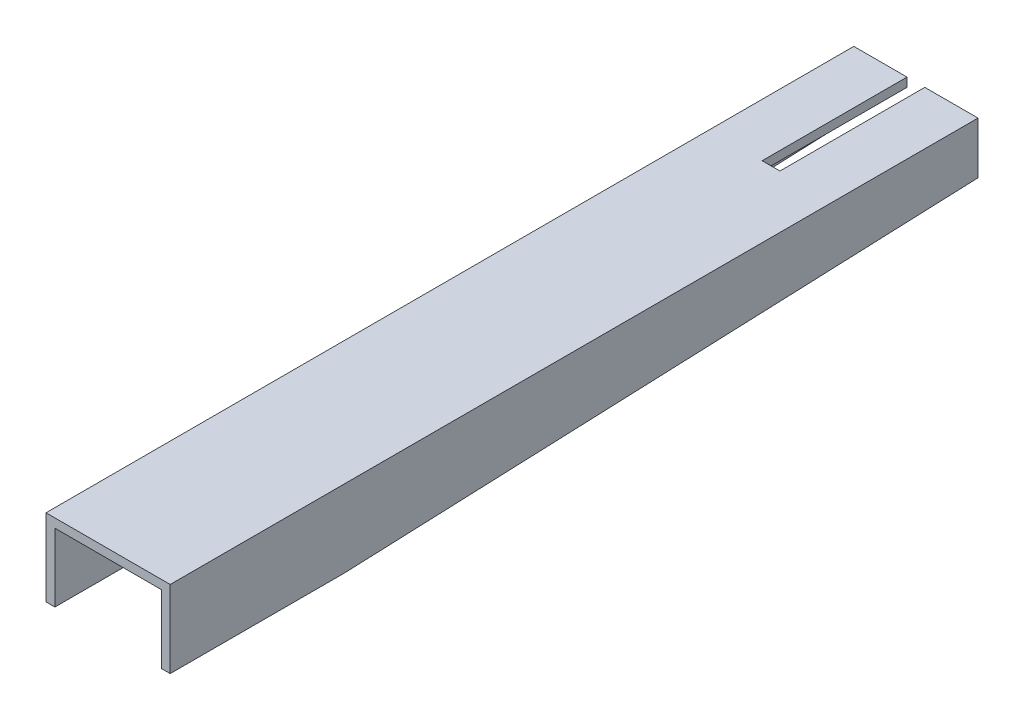
ISO-10303-21;
HEADER;
FILE_DESCRIPTION(('STEP AP214'),'2;1');
FILE_NAME('part.step','',(''),(''),'','','');
FILE_SCHEMA(('AUTOMOTIVE_DESIGN { 1 0 10303 214 1 1 1 1 }'));
ENDSEC;
DATA;
#1=APPLICATION_CONTEXT('core data for automotive mechanical design processes');
#2=APPLICATION_PROTOCOL_DEFINITION('international standard','automotive_design',2000,#1);
#3=PRODUCT_CONTEXT('',#1,'mechanical');
#4=PRODUCT('Part','Part','',(#3));
#5=PRODUCT_RELATED_PRODUCT_CATEGORY('part','',(#4));
#6=PRODUCT_DEFINITION_FORMATION('','',#4);
#7=PRODUCT_DEFINITION_CONTEXT('part definition',#1,'design');
#8=PRODUCT_DEFINITION('design','',#6,#7);
#9=PRODUCT_DEFINITION_SHAPE('','',#8);
#10=(LENGTH_UNIT() NAMED_UNIT(*) SI_UNIT(.MILLI.,.METRE.));
#11=(NAMED_UNIT(*) PLANE_ANGLE_UNIT() SI_UNIT($,.RADIAN.));
#12=(NAMED_UNIT(*) SI_UNIT($,.STERADIAN.) SOLID_ANGLE_UNIT());
#13=UNCERTAINTY_MEASURE_WITH_UNIT(LENGTH_MEASURE(1.E-05),#10,'distance_accuracy_value','');
#14=(GEOMETRIC_REPRESENTATION_CONTEXT(3) GLOBAL_UNCERTAINTY_ASSIGNED_CONTEXT((#13)) GLOBAL_UNIT_ASSIGNED_CONTEXT((#10,
#11,#12)) REPRESENTATION_CONTEXT('',''));
#15=CARTESIAN_POINT('',(0.,0.,0.));
#16=DIRECTION('',(0.,0.,1.));
#17=DIRECTION('',(1.,0.,0.));
#18=AXIS2_PLACEMENT_3D('',#15,#16,#17);
#19=CARTESIAN_POINT('',(0.,0.,0.));
#20=DIRECTION('',(0.,0.,1.));
#21=DIRECTION('',(1.,0.,0.));
#22=AXIS2_PLACEMENT_3D('',#19,#20,#21);
#23=PLANE('',#22);
#24=DIRECTION('',(-1.,0.,0.));
#25=VECTOR('',#24,1.);
#26=CARTESIAN_POINT('',(30.,25.,0.));
#27=LINE('',#26,#25);
#28=CARTESIAN_POINT('',(-4.3,25.,0.));
#29=VERTEX_POINT('',#28);
#30=CARTESIAN_POINT('',(-30.,25.,0.));
#31=VERTEX_POINT('',#30);
#32=EDGE_CURVE('E90',#29,#31,#27,.T.);
#33=ORIENTED_EDGE('',*,*,#32,.F.);
#34=DIRECTION('',(0.,-1.,0.));
#35=VECTOR('',#34,1.);
#36=CARTESIAN_POINT('',(-4.3,0.,0.));
#37=LINE('',#36,#35);
#38=CARTESIAN_POINT('',(-4.3,20.7,0.));
#39=VERTEX_POINT('',#38);
#40=EDGE_CURVE('E11',#29,#39,#37,.T.);
#41=ORIENTED_EDGE('',*,*,#40,.T.);
#42=DIRECTION('',(1.,0.,0.));
#43=VECTOR('',#42,1.);
#44=CARTESIAN_POINT('',(-25.7,20.7,0.));
#45=LINE('',#44,#43);
#46=CARTESIAN_POINT('',(-25.7,20.7,0.));
#47=VERTEX_POINT('',#46);
#48=EDGE_CURVE('E260',#47,#39,#45,.T.);
#49=ORIENTED_EDGE('',*,*,#48,.F.);
#50=DIRECTION('',(0.,1.,0.));
#51=VECTOR('',#50,1.);
#52=CARTESIAN_POINT('',(-25.7,0.,0.));
#53=LINE('',#52,#51);
#54=CARTESIAN_POINT('',(-25.7,0.,0.));
#55=VERTEX_POINT('',#54);
#56=EDGE_CURVE('E256',#55,#47,#53,.T.);
#57=ORIENTED_EDGE('',*,*,#56,.F.);
#58=DIRECTION('',(1.,0.,0.));
#59=VECTOR('',#58,1.);
#60=CARTESIAN_POINT('',(-30.,0.,0.));
#61=LINE('',#60,#59);
#62=CARTESIAN_POINT('',(-30.,0.,0.));
#63=VERTEX_POINT('',#62);
#64=EDGE_CURVE('E252',#63,#55,#61,.T.);
#65=ORIENTED_EDGE('',*,*,#64,.F.);
#66=DIRECTION('',(0.,-1.,0.));
#67=VECTOR('',#66,1.);
#68=CARTESIAN_POINT('',(-30.,25.,0.));
#69=LINE('',#68,#67);
#70=EDGE_CURVE('E228',#31,#63,#69,.T.);
#71=ORIENTED_EDGE('',*,*,#70,.F.);
#72=EDGE_LOOP('',(#33,#41,#49,#57,#65,#71));
#73=FACE_BOUND('',#72,.T.);
#74=ADVANCED_FACE('F38',(#73),#23,.F.);
#75=CARTESIAN_POINT('',(-30.,25.,390.3));
#76=DIRECTION('',(1.,0.,0.));
#77=DIRECTION('',(0.,0.,-1.));
#78=AXIS2_PLACEMENT_3D('',#75,#76,#77);
#79=PLANE('',#78);
#80=ORIENTED_EDGE('',*,*,#70,.T.);
#81=DIRECTION('',(0.,0.040196245461984,-0.999191804335264));
#82=VECTOR('',#81,1.);
#83=CARTESIAN_POINT('',(-30.,-12.31,306.));
#84=LINE('',#83,#82);
#85=CARTESIAN_POINT('',(-30.,-12.31,306.));
#86=VERTEX_POINT('',#85);
#87=EDGE_CURVE('E189',#86,#63,#84,.T.);
#88=ORIENTED_EDGE('',*,*,#87,.F.);
#89=DIRECTION('',(0.,0.,-1.));
#90=VECTOR('',#89,1.);
#91=CARTESIAN_POINT('',(-30.,-12.31,390.3));
#92=LINE('',#91,#90);
#93=CARTESIAN_POINT('',(-30.,-12.31,390.3));
#94=VERTEX_POINT('',#93);
#95=EDGE_CURVE('E183',#94,#86,#92,.T.);
#96=ORIENTED_EDGE('',*,*,#95,.F.);
#97=DIRECTION('',(0.,-1.,0.));
#98=VECTOR('',#97,1.);
#99=CARTESIAN_POINT('',(-30.,25.,390.3));
#100=LINE('',#99,#98);
#101=CARTESIAN_POINT('',(-30.,25.,390.3));
#102=VERTEX_POINT('',#101);
#103=EDGE_CURVE('E231',#102,#94,#100,.T.);
#104=ORIENTED_EDGE('',*,*,#103,.F.);
#105=DIRECTION('',(0.,0.,-1.));
#106=VECTOR('',#105,1.);
#107=CARTESIAN_POINT('',(-30.,25.,390.3));
#108=LINE('',#107,#106);
#109=EDGE_CURVE('E248',#102,#31,#108,.T.);
#110=ORIENTED_EDGE('',*,*,#109,.T.);
#111=EDGE_LOOP('',(#80,#88,#96,#104,#110));
#112=FACE_BOUND('',#111,.T.);
#113=ADVANCED_FACE('F40',(#112),#79,.F.);
#114=CARTESIAN_POINT('',(-25.7,0.,390.3));
#115=DIRECTION('',(-1.,0.,0.));
#116=DIRECTION('',(0.,0.,1.));
#117=AXIS2_PLACEMENT_3D('',#114,#115,#116);
#118=PLANE('',#117);
#119=ORIENTED_EDGE('',*,*,#56,.T.);
#120=DIRECTION('',(0.,0.,-1.));
#121=VECTOR('',#120,1.);
#122=CARTESIAN_POINT('',(-25.7,20.7,390.3));
#123=LINE('',#122,#121);
#124=CARTESIAN_POINT('',(-25.7,20.7,390.3));
#125=VERTEX_POINT('',#124);
#126=EDGE_CURVE('E286',#125,#47,#123,.T.);
#127=ORIENTED_EDGE('',*,*,#126,.F.);
#128=DIRECTION('',(0.,1.,0.));
#129=VECTOR('',#128,1.);
#130=CARTESIAN_POINT('',(-25.7,0.,390.3));
#131=LINE('',#130,#129);
#132=CARTESIAN_POINT('',(-25.7,-12.31,390.3));
#133=VERTEX_POINT('',#132);
#134=EDGE_CURVE('E97',#133,#125,#131,.T.);
#135=ORIENTED_EDGE('',*,*,#134,.F.);
#136=DIRECTION('',(0.,0.,-1.));
#137=VECTOR('',#136,1.);
#138=CARTESIAN_POINT('',(-25.7,-12.31,390.3));
#139=LINE('',#138,#137);
#140=CARTESIAN_POINT('',(-25.7,-12.31,306.));
#141=VERTEX_POINT('',#140);
#142=EDGE_CURVE('E184',#133,#141,#139,.T.);
#143=ORIENTED_EDGE('',*,*,#142,.T.);
#144=DIRECTION('',(0.,0.040196245461984,-0.999191804335264));
#145=VECTOR('',#144,1.);
#146=CARTESIAN_POINT('',(-25.7,-12.31,306.));
#147=LINE('',#146,#145);
#148=EDGE_CURVE('E188',#141,#55,#147,.T.);
#149=ORIENTED_EDGE('',*,*,#148,.T.);
#150=EDGE_LOOP('',(#119,#127,#135,#143,#149));
#151=FACE_BOUND('',#150,.T.);
#152=ADVANCED_FACE('F332',(#151),#118,.F.);
#153=CARTESIAN_POINT('',(-25.7,20.7,390.3));
#154=DIRECTION('',(0.,1.,0.));
#155=DIRECTION('',(0.,0.,1.));
#156=AXIS2_PLACEMENT_3D('',#153,#154,#155);
#157=PLANE('',#156);
#158=ORIENTED_EDGE('',*,*,#48,.T.);
#159=DIRECTION('',(0.,0.,1.));
#160=VECTOR('',#159,1.);
#161=CARTESIAN_POINT('',(-4.29999999999995,20.7,390.3));
#162=LINE('',#161,#160);
#163=CARTESIAN_POINT('',(-4.29999999999999,20.7,70.));
#164=VERTEX_POINT('',#163);
#165=EDGE_CURVE('E178',#39,#164,#162,.T.);
#166=ORIENTED_EDGE('',*,*,#165,.T.);
#167=DIRECTION('',(1.,0.,0.));
#168=VECTOR('',#167,1.);
#169=CARTESIAN_POINT('',(-25.7,20.7,70.));
#170=LINE('',#169,#168);
#171=CARTESIAN_POINT('',(4.29999999999999,20.7,70.));
#172=VERTEX_POINT('',#171);
#173=EDGE_CURVE('E155',#164,#172,#170,.T.);
#174=ORIENTED_EDGE('',*,*,#173,.T.);
#175=DIRECTION('',(0.,0.,-1.));
#176=VECTOR('',#175,1.);
#177=CARTESIAN_POINT('',(4.29999999999995,20.7,390.3));
#178=LINE('',#177,#176);
#179=CARTESIAN_POINT('',(4.3,20.7,0.));
#180=VERTEX_POINT('',#179);
#181=EDGE_CURVE('E173',#172,#180,#178,.T.);
#182=ORIENTED_EDGE('',*,*,#181,.T.);
#183=CARTESIAN_POINT('',(25.7,20.7,0.));
#184=VERTEX_POINT('',#183);
#185=EDGE_CURVE('E259',#180,#184,#45,.T.);
#186=ORIENTED_EDGE('',*,*,#185,.T.);
#187=DIRECTION('',(0.,0.,-1.));
#188=VECTOR('',#187,1.);
#189=CARTESIAN_POINT('',(25.7,20.7,390.3));
#190=LINE('',#189,#188);
#191=CARTESIAN_POINT('',(25.7,20.7,390.3));
#192=VERTEX_POINT('',#191);
#193=EDGE_CURVE('E282',#192,#184,#190,.T.);
#194=ORIENTED_EDGE('',*,*,#193,.F.);
#195=DIRECTION('',(1.,0.,0.));
#196=VECTOR('',#195,1.);
#197=CARTESIAN_POINT('',(-25.7,20.7,390.3));
#198=LINE('',#197,#196);
#199=EDGE_CURVE('E237',#125,#192,#198,.T.);
#200=ORIENTED_EDGE('',*,*,#199,.F.);
#201=ORIENTED_EDGE('',*,*,#126,.T.);
#202=EDGE_LOOP('',(#158,#166,#174,#182,#186,#194,#200,#201));
#203=FACE_BOUND('',#202,.T.);
#204=ADVANCED_FACE('F315',(#203),#157,.F.);
#205=CARTESIAN_POINT('',(25.7,20.7,390.3));
#206=DIRECTION('',(1.,0.,0.));
#207=DIRECTION('',(0.,0.,-1.));
#208=AXIS2_PLACEMENT_3D('',#205,#206,#207);
#209=PLANE('',#208);
#210=DIRECTION('',(0.,-1.,0.));
#211=VECTOR('',#210,1.);
#212=CARTESIAN_POINT('',(25.7,20.7,0.));
#213=LINE('',#212,#211);
#214=CARTESIAN_POINT('',(25.7,0.,0.));
#215=VERTEX_POINT('',#214);
#216=EDGE_CURVE('E264',#184,#215,#213,.T.);
#217=ORIENTED_EDGE('',*,*,#216,.T.);
#218=DIRECTION('',(0.,0.040196245461984,-0.999191804335264));
#219=VECTOR('',#218,1.);
#220=CARTESIAN_POINT('',(25.7,-12.31,306.));
#221=LINE('',#220,#219);
#222=CARTESIAN_POINT('',(25.7,-12.31,306.));
#223=VERTEX_POINT('',#222);
#224=EDGE_CURVE('E212',#223,#215,#221,.T.);
#225=ORIENTED_EDGE('',*,*,#224,.F.);
#226=DIRECTION('',(0.,0.,-1.));
#227=VECTOR('',#226,1.);
#228=CARTESIAN_POINT('',(25.7,-12.31,390.3));
#229=LINE('',#228,#227);
#230=CARTESIAN_POINT('',(25.7,-12.31,390.3));
#231=VERTEX_POINT('',#230);
#232=EDGE_CURVE('E208',#231,#223,#229,.T.);
#233=ORIENTED_EDGE('',*,*,#232,.F.);
#234=DIRECTION('',(0.,-1.,0.));
#235=VECTOR('',#234,1.);
#236=CARTESIAN_POINT('',(25.7,20.7,390.3));
#237=LINE('',#236,#235);
#238=EDGE_CURVE('E240',#192,#231,#237,.T.);
#239=ORIENTED_EDGE('',*,*,#238,.F.);
#240=ORIENTED_EDGE('',*,*,#193,.T.);
#241=EDGE_LOOP('',(#217,#225,#233,#239,#240));
#242=FACE_BOUND('',#241,.T.);
#243=ADVANCED_FACE('F305',(#242),#209,.F.);
#244=CARTESIAN_POINT('',(30.,0.,390.3));
#245=DIRECTION('',(-1.,0.,0.));
#246=DIRECTION('',(0.,0.,1.));
#247=AXIS2_PLACEMENT_3D('',#244,#245,#246);
#248=PLANE('',#247);
#249=DIRECTION('',(0.,1.,0.));
#250=VECTOR('',#249,1.);
#251=CARTESIAN_POINT('',(30.,0.,0.));
#252=LINE('',#251,#250);
#253=CARTESIAN_POINT('',(30.,0.,0.));
#254=VERTEX_POINT('',#253);
#255=CARTESIAN_POINT('',(30.,25.,0.));
#256=VERTEX_POINT('',#255);
#257=EDGE_CURVE('E271',#254,#256,#252,.T.);
#258=ORIENTED_EDGE('',*,*,#257,.T.);
#259=DIRECTION('',(0.,0.,-1.));
#260=VECTOR('',#259,1.);
#261=CARTESIAN_POINT('',(30.,25.,390.3));
#262=LINE('',#261,#260);
#263=CARTESIAN_POINT('',(30.,25.,390.3));
#264=VERTEX_POINT('',#263);
#265=EDGE_CURVE('E278',#264,#256,#262,.T.);
#266=ORIENTED_EDGE('',*,*,#265,.F.);
#267=DIRECTION('',(0.,1.,0.));
#268=VECTOR('',#267,1.);
#269=CARTESIAN_POINT('',(30.,0.,390.3));
#270=LINE('',#269,#268);
#271=CARTESIAN_POINT('',(30.,-12.31,390.3));
#272=VERTEX_POINT('',#271);
#273=EDGE_CURVE('E243',#272,#264,#270,.T.);
#274=ORIENTED_EDGE('',*,*,#273,.F.);
#275=DIRECTION('',(0.,0.,-1.));
#276=VECTOR('',#275,1.);
#277=CARTESIAN_POINT('',(30.,-12.31,390.3));
#278=LINE('',#277,#276);
#279=CARTESIAN_POINT('',(30.,-12.31,306.));
#280=VERTEX_POINT('',#279);
#281=EDGE_CURVE('E204',#272,#280,#278,.T.);
#282=ORIENTED_EDGE('',*,*,#281,.T.);
#283=DIRECTION('',(0.,0.040196245461984,-0.999191804335264));
#284=VECTOR('',#283,1.);
#285=CARTESIAN_POINT('',(30.,-12.31,306.));
#286=LINE('',#285,#284);
#287=EDGE_CURVE('E213',#280,#254,#286,.T.);
#288=ORIENTED_EDGE('',*,*,#287,.T.);
#289=EDGE_LOOP('',(#258,#266,#274,#282,#288));
#290=FACE_BOUND('',#289,.T.);
#291=ADVANCED_FACE('F297',(#290),#248,.F.);
#292=CARTESIAN_POINT('',(30.,25.,390.3));
#293=DIRECTION('',(0.,-1.,0.));
#294=DIRECTION('',(0.,0.,-1.));
#295=AXIS2_PLACEMENT_3D('',#292,#293,#294);
#296=PLANE('',#295);
#297=DIRECTION('',(1.,0.,0.));
#298=VECTOR('',#297,1.);
#299=CARTESIAN_POINT('',(-4.29999999999999,25.,70.));
#300=LINE('',#299,#298);
#301=CARTESIAN_POINT('',(-4.29999999999999,25.,70.));
#302=VERTEX_POINT('',#301);
#303=CARTESIAN_POINT('',(4.29999999999999,25.,70.));
#304=VERTEX_POINT('',#303);
#305=EDGE_CURVE('E153',#302,#304,#300,.T.);
#306=ORIENTED_EDGE('',*,*,#305,.F.);
#307=DIRECTION('',(0.,0.,1.));
#308=VECTOR('',#307,1.);
#309=CARTESIAN_POINT('',(-4.3,25.,0.));
#310=LINE('',#309,#308);
#311=EDGE_CURVE('E161',#29,#302,#310,.T.);
#312=ORIENTED_EDGE('',*,*,#311,.F.);
#313=ORIENTED_EDGE('',*,*,#32,.T.);
#314=ORIENTED_EDGE('',*,*,#109,.F.);
#315=DIRECTION('',(-1.,0.,0.));
#316=VECTOR('',#315,1.);
#317=CARTESIAN_POINT('',(30.,25.,390.3));
#318=LINE('',#317,#316);
#319=EDGE_CURVE('E63',#264,#102,#318,.T.);
#320=ORIENTED_EDGE('',*,*,#319,.F.);
#321=ORIENTED_EDGE('',*,*,#265,.T.);
#322=CARTESIAN_POINT('',(4.3,25.,0.));
#323=VERTEX_POINT('',#322);
#324=EDGE_CURVE('E234',#256,#323,#27,.T.);
#325=ORIENTED_EDGE('',*,*,#324,.T.);
#326=DIRECTION('',(0.,0.,-1.));
#327=VECTOR('',#326,1.);
#328=CARTESIAN_POINT('',(4.3,25.,0.));
#329=LINE('',#328,#327);
#330=EDGE_CURVE('E54',#304,#323,#329,.T.);
#331=ORIENTED_EDGE('',*,*,#330,.F.);
#332=EDGE_LOOP('',(#306,#312,#313,#314,#320,#321,#325,#331));
#333=FACE_BOUND('',#332,.T.);
#334=ADVANCED_FACE('F165',(#333),#296,.F.);
#335=CARTESIAN_POINT('',(0.,0.,390.3));
#336=DIRECTION('',(0.,0.,1.));
#337=DIRECTION('',(1.,0.,0.));
#338=AXIS2_PLACEMENT_3D('',#335,#336,#337);
#339=PLANE('',#338);
#340=ORIENTED_EDGE('',*,*,#103,.T.);
#341=DIRECTION('',(-1.,0.,0.));
#342=VECTOR('',#341,1.);
#343=CARTESIAN_POINT('',(-25.7,-12.31,390.3));
#344=LINE('',#343,#342);
#345=EDGE_CURVE('E193',#133,#94,#344,.T.);
#346=ORIENTED_EDGE('',*,*,#345,.F.);
#347=ORIENTED_EDGE('',*,*,#134,.T.);
#348=ORIENTED_EDGE('',*,*,#199,.T.);
#349=ORIENTED_EDGE('',*,*,#238,.T.);
#350=DIRECTION('',(1.,0.,0.));
#351=VECTOR('',#350,1.);
#352=CARTESIAN_POINT('',(25.7,-12.31,390.3));
#353=LINE('',#352,#351);
#354=EDGE_CURVE('E224',#231,#272,#353,.T.);
#355=ORIENTED_EDGE('',*,*,#354,.T.);
#356=ORIENTED_EDGE('',*,*,#273,.T.);
#357=ORIENTED_EDGE('',*,*,#319,.T.);
#358=EDGE_LOOP('',(#340,#346,#347,#348,#349,#355,#356,#357));
#359=FACE_BOUND('',#358,.T.);
#360=ADVANCED_FACE('F311',(#359),#339,.T.);
#361=ORIENTED_EDGE('',*,*,#185,.F.);
#362=DIRECTION('',(0.,1.,0.));
#363=VECTOR('',#362,1.);
#364=CARTESIAN_POINT('',(4.3,0.,0.));
#365=LINE('',#364,#363);
#366=EDGE_CURVE('E47',#180,#323,#365,.T.);
#367=ORIENTED_EDGE('',*,*,#366,.T.);
#368=ORIENTED_EDGE('',*,*,#324,.F.);
#369=ORIENTED_EDGE('',*,*,#257,.F.);
#370=DIRECTION('',(1.,0.,0.));
#371=VECTOR('',#370,1.);
#372=CARTESIAN_POINT('',(25.7,0.,0.));
#373=LINE('',#372,#371);
#374=EDGE_CURVE('E267',#215,#254,#373,.T.);
#375=ORIENTED_EDGE('',*,*,#374,.F.);
#376=ORIENTED_EDGE('',*,*,#216,.F.);
#377=EDGE_LOOP('',(#361,#367,#368,#369,#375,#376));
#378=FACE_BOUND('',#377,.T.);
#379=ADVANCED_FACE('F293',(#378),#23,.F.);
#380=CARTESIAN_POINT('',(25.7,-12.31,390.3));
#381=DIRECTION('',(0.,-1.,0.));
#382=DIRECTION('',(1.,0.,0.));
#383=AXIS2_PLACEMENT_3D('',#380,#381,#382);
#384=PLANE('',#383);
#385=ORIENTED_EDGE('',*,*,#281,.F.);
#386=ORIENTED_EDGE('',*,*,#354,.F.);
#387=ORIENTED_EDGE('',*,*,#232,.T.);
#388=DIRECTION('',(1.,0.,0.));
#389=VECTOR('',#388,1.);
#390=CARTESIAN_POINT('',(25.7,-12.31,306.));
#391=LINE('',#390,#389);
#392=EDGE_CURVE('E217',#223,#280,#391,.T.);
#393=ORIENTED_EDGE('',*,*,#392,.T.);
#394=EDGE_LOOP('',(#385,#386,#387,#393));
#395=FACE_BOUND('',#394,.T.);
#396=ADVANCED_FACE('F310',(#395),#384,.T.);
#397=CARTESIAN_POINT('',(25.7,-12.31,306.));
#398=DIRECTION('',(0.,-0.999191804335264,-0.040196245461984));
#399=DIRECTION('',(0.,0.040196245461984,-0.999191804335264));
#400=AXIS2_PLACEMENT_3D('',#397,#398,#399);
#401=PLANE('',#400);
#402=ORIENTED_EDGE('',*,*,#287,.F.);
#403=ORIENTED_EDGE('',*,*,#392,.F.);
#404=ORIENTED_EDGE('',*,*,#224,.T.);
#405=ORIENTED_EDGE('',*,*,#374,.T.);
#406=EDGE_LOOP('',(#402,#403,#404,#405));
#407=FACE_BOUND('',#406,.T.);
#408=ADVANCED_FACE('F301',(#407),#401,.T.);
#409=CARTESIAN_POINT('',(-25.7,-12.31,390.3));
#410=DIRECTION('',(0.,1.,0.));
#411=DIRECTION('',(-1.,0.,0.));
#412=AXIS2_PLACEMENT_3D('',#409,#410,#411);
#413=PLANE('',#412);
#414=ORIENTED_EDGE('',*,*,#95,.T.);
#415=DIRECTION('',(-1.,0.,0.));
#416=VECTOR('',#415,1.);
#417=CARTESIAN_POINT('',(-25.7,-12.31,306.));
#418=LINE('',#417,#416);
#419=EDGE_CURVE('E200',#141,#86,#418,.T.);
#420=ORIENTED_EDGE('',*,*,#419,.F.);
#421=ORIENTED_EDGE('',*,*,#142,.F.);
#422=ORIENTED_EDGE('',*,*,#345,.T.);
#423=EDGE_LOOP('',(#414,#420,#421,#422));
#424=FACE_BOUND('',#423,.T.);
#425=ADVANCED_FACE('F348',(#424),#413,.F.);
#426=CARTESIAN_POINT('',(-25.7,-12.31,306.));
#427=DIRECTION('',(0.,0.999191804335264,0.040196245461984));
#428=DIRECTION('',(0.,-0.040196245461984,0.999191804335264));
#429=AXIS2_PLACEMENT_3D('',#426,#427,#428);
#430=PLANE('',#429);
#431=ORIENTED_EDGE('',*,*,#87,.T.);
#432=ORIENTED_EDGE('',*,*,#64,.T.);
#433=ORIENTED_EDGE('',*,*,#148,.F.);
#434=ORIENTED_EDGE('',*,*,#419,.T.);
#435=EDGE_LOOP('',(#431,#432,#433,#434));
#436=FACE_BOUND('',#435,.T.);
#437=ADVANCED_FACE('F351',(#436),#430,.F.);
#438=CARTESIAN_POINT('',(-4.29999999999999,15.,70.));
#439=DIRECTION('',(0.,0.,1.));
#440=DIRECTION('',(1.,0.,0.));
#441=AXIS2_PLACEMENT_3D('',#438,#439,#440);
#442=PLANE('',#441);
#443=DIRECTION('',(0.,1.,0.));
#444=VECTOR('',#443,1.);
#445=CARTESIAN_POINT('',(-4.29999999999999,15.,70.));
#446=LINE('',#445,#444);
#447=EDGE_CURVE('E148',#164,#302,#446,.T.);
#448=ORIENTED_EDGE('',*,*,#447,.T.);
#449=ORIENTED_EDGE('',*,*,#305,.T.);
#450=DIRECTION('',(0.,1.,0.));
#451=VECTOR('',#450,1.);
#452=CARTESIAN_POINT('',(4.29999999999999,15.,70.));
#453=LINE('',#452,#451);
#454=EDGE_CURVE('E159',#172,#304,#453,.T.);
#455=ORIENTED_EDGE('',*,*,#454,.F.);
#456=ORIENTED_EDGE('',*,*,#173,.F.);
#457=EDGE_LOOP('',(#448,#449,#455,#456));
#458=FACE_BOUND('',#457,.T.);
#459=ADVANCED_FACE('F150',(#458),#442,.F.);
#460=CARTESIAN_POINT('',(-4.3,15.,0.));
#461=DIRECTION('',(-1.,0.,0.));
#462=DIRECTION('',(0.,0.,1.));
#463=AXIS2_PLACEMENT_3D('',#460,#461,#462);
#464=PLANE('',#463);
#465=ORIENTED_EDGE('',*,*,#40,.F.);
#466=ORIENTED_EDGE('',*,*,#311,.T.);
#467=ORIENTED_EDGE('',*,*,#447,.F.);
#468=ORIENTED_EDGE('',*,*,#165,.F.);
#469=EDGE_LOOP('',(#465,#466,#467,#468));
#470=FACE_BOUND('',#469,.T.);
#471=ADVANCED_FACE('F162',(#470),#464,.F.);
#472=CARTESIAN_POINT('',(4.3,15.,0.));
#473=DIRECTION('',(1.,0.,0.));
#474=DIRECTION('',(0.,0.,-1.));
#475=AXIS2_PLACEMENT_3D('',#472,#473,#474);
#476=PLANE('',#475);
#477=ORIENTED_EDGE('',*,*,#454,.T.);
#478=ORIENTED_EDGE('',*,*,#330,.T.);
#479=ORIENTED_EDGE('',*,*,#366,.F.);
#480=ORIENTED_EDGE('',*,*,#181,.F.);
#481=EDGE_LOOP('',(#477,#478,#479,#480));
#482=FACE_BOUND('',#481,.T.);
#483=ADVANCED_FACE('F318',(#482),#476,.F.);
#484=CLOSED_SHELL('',(#74,#113,#152,#204,#243,#291,#334,#360,#379,#396,#408,#425,#437,#459,#471,#483));
#485=MANIFOLD_SOLID_BREP('B2',#484);
#486=ADVANCED_BREP_SHAPE_REPRESENTATION('',(#18,#485),#14);
#487=SHAPE_DEFINITION_REPRESENTATION(#9,#486);
ENDSEC;
END-ISO-10303-21;
